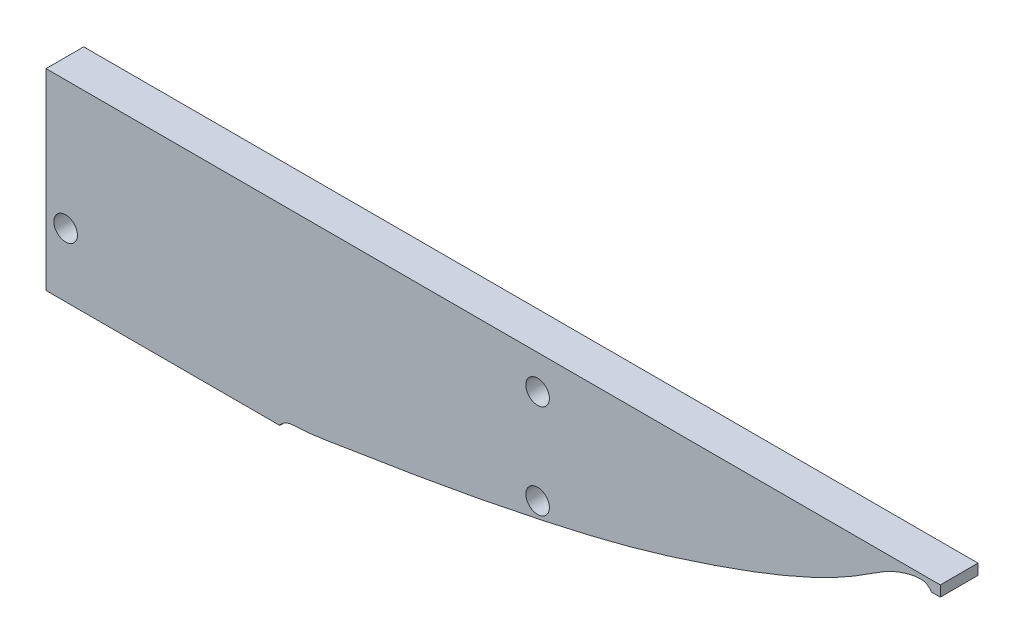
ISO-10303-21;
HEADER;
FILE_DESCRIPTION(('STEP AP214'),'2;1');
FILE_NAME('part.step','',(''),(''),'','','');
FILE_SCHEMA(('AUTOMOTIVE_DESIGN { 1 0 10303 214 1 1 1 1 }'));
ENDSEC;
DATA;
#1=APPLICATION_CONTEXT('core data for automotive mechanical design processes');
#2=APPLICATION_PROTOCOL_DEFINITION('international standard','automotive_design',2000,#1);
#3=PRODUCT_CONTEXT('',#1,'mechanical');
#4=PRODUCT('Part','Part','',(#3));
#5=PRODUCT_RELATED_PRODUCT_CATEGORY('part','',(#4));
#6=PRODUCT_DEFINITION_FORMATION('','',#4);
#7=PRODUCT_DEFINITION_CONTEXT('part definition',#1,'design');
#8=PRODUCT_DEFINITION('design','',#6,#7);
#9=PRODUCT_DEFINITION_SHAPE('','',#8);
#10=(LENGTH_UNIT() NAMED_UNIT(*) SI_UNIT(.MILLI.,.METRE.));
#11=(NAMED_UNIT(*) PLANE_ANGLE_UNIT() SI_UNIT($,.RADIAN.));
#12=(NAMED_UNIT(*) SI_UNIT($,.STERADIAN.) SOLID_ANGLE_UNIT());
#13=UNCERTAINTY_MEASURE_WITH_UNIT(LENGTH_MEASURE(1.E-05),#10,'distance_accuracy_value','');
#14=(GEOMETRIC_REPRESENTATION_CONTEXT(3) GLOBAL_UNCERTAINTY_ASSIGNED_CONTEXT((#13)) GLOBAL_UNIT_ASSIGNED_CONTEXT((#10,
#11,#12)) REPRESENTATION_CONTEXT('',''));
#15=CARTESIAN_POINT('',(0.,0.,0.));
#16=DIRECTION('',(0.,0.,1.));
#17=DIRECTION('',(1.,0.,0.));
#18=AXIS2_PLACEMENT_3D('',#15,#16,#17);
#19=CARTESIAN_POINT('',(16.5327715800535,-24.4684718343884,308.));
#20=DIRECTION('',(0.,0.,-1.));
#21=DIRECTION('',(-1.,0.,0.));
#22=AXIS2_PLACEMENT_3D('',#19,#20,#21);
#23=PLANE('',#22);
#24=CARTESIAN_POINT('',(0.0705666698621599,-25.,308.));
#25=DIRECTION('',(0.,0.,-1.));
#26=DIRECTION('',(-1.,0.,0.));
#27=AXIS2_PLACEMENT_3D('',#24,#25,#26);
#28=CIRCLE('',#27,2.5);
#29=CARTESIAN_POINT('',(-2.42943333013784,-25.,308.));
#30=VERTEX_POINT('',#29);
#31=EDGE_CURVE('E246',#30,#30,#28,.F.);
#32=ORIENTED_EDGE('',*,*,#31,.F.);
#33=EDGE_LOOP('',(#32));
#34=FACE_BOUND('',#33,.T.);
#35=CARTESIAN_POINT('',(83.5994431739806,0.,308.));
#36=CARTESIAN_POINT('',(83.569014411832,0.0928823345712149,308.));
#37=CARTESIAN_POINT('',(83.5110052269392,0.172261108299648,308.));
#38=CARTESIAN_POINT('',(83.3760459387699,0.311907780049764,308.));
#39=CARTESIAN_POINT('',(83.3022919426749,0.374486092446247,308.));
#40=CARTESIAN_POINT('',(83.0817548813278,0.563058106145713,308.));
#41=CARTESIAN_POINT('',(82.938606402496,0.693248681310297,308.));
#42=CARTESIAN_POINT('',(82.6268716090671,0.924256644247235,308.));
#43=CARTESIAN_POINT('',(82.4623978542379,1.023272232158,308.));
#44=CARTESIAN_POINT('',(82.1016141202814,1.15954203405239,308.));
#45=CARTESIAN_POINT('',(81.9099773876242,1.19977717663149,308.));
#46=CARTESIAN_POINT('',(81.5288046390951,1.24481375090888,308.));
#47=CARTESIAN_POINT('',(81.3359366722028,1.25109399115655,308.));
#48=CARTESIAN_POINT('',(80.9496815449031,1.24567023160893,308.));
#49=CARTESIAN_POINT('',(80.7580322473343,1.23478307545273,308.));
#50=CARTESIAN_POINT('',(80.1867358356821,1.18192776826324,308.));
#51=CARTESIAN_POINT('',(79.8109144596942,1.11880208226468,308.));
#52=CARTESIAN_POINT('',(79.0640908517205,0.965899328184112,308.));
#53=CARTESIAN_POINT('',(78.6931653849524,0.875697724303409,308.));
#54=CARTESIAN_POINT('',(77.9557369644508,0.670836628462019,308.));
#55=CARTESIAN_POINT('',(77.589112504302,0.556414448791862,308.));
#56=CARTESIAN_POINT('',(76.5077350097606,0.184710813679019,308.));
#57=CARTESIAN_POINT('',(75.8074438446993,-0.103386236731456,308.));
#58=CARTESIAN_POINT('',(73.7664261730245,-1.08460417480571,308.));
#59=CARTESIAN_POINT('',(72.4826351030643,-1.88894694991597,308.));
#60=CARTESIAN_POINT('',(70.5711059909208,-3.12311740474168,308.));
#61=CARTESIAN_POINT('',(69.9359040916411,-3.5383265786026,308.));
#62=CARTESIAN_POINT('',(68.6576436677939,-4.35384217855476,308.));
#63=CARTESIAN_POINT('',(68.0155077590781,-4.75592773253934,308.));
#64=CARTESIAN_POINT('',(66.0720305681863,-5.92997149689604,308.));
#65=CARTESIAN_POINT('',(64.7527934355934,-6.66815728349756,308.));
#66=CARTESIAN_POINT('',(62.0824395903838,-8.08436682689352,308.));
#67=CARTESIAN_POINT('',(60.7316772443977,-8.76305933201459,308.));
#68=CARTESIAN_POINT('',(58.0065992277551,-10.0759953307011,308.));
#69=CARTESIAN_POINT('',(56.6320573002908,-10.7098118403225,308.));
#70=CARTESIAN_POINT('',(53.8593195487676,-11.9328060521872,308.));
#71=CARTESIAN_POINT('',(52.4619833156743,-12.522156219572,308.));
#72=CARTESIAN_POINT('',(48.2501943680671,-14.2346740533643,308.));
#73=CARTESIAN_POINT('',(45.4141180418152,-15.3076903903626,308.));
#74=CARTESIAN_POINT('',(39.7124997352837,-17.3690101771438,308.));
#75=CARTESIAN_POINT('',(36.8450597623796,-18.3548456149246,308.));
#76=CARTESIAN_POINT('',(31.087506026426,-20.2519081080058,308.));
#77=CARTESIAN_POINT('',(28.1975476603768,-21.1641240834605,308.));
#78=CARTESIAN_POINT('',(22.3884258684236,-22.8937038366736,308.));
#79=CARTESIAN_POINT('',(19.4670292352081,-23.7076814815292,308.));
#80=CARTESIAN_POINT('',(13.5985139248987,-25.2292621872477,308.));
#81=CARTESIAN_POINT('',(10.6516305069243,-25.9371829190082,308.));
#82=CARTESIAN_POINT('',(4.74215554202897,-27.2872475389897,308.));
#83=CARTESIAN_POINT('',(1.78010703581329,-27.9328314143551,308.));
#84=CARTESIAN_POINT('',(-4.15195666526218,-29.1841441009789,308.));
#85=CARTESIAN_POINT('',(-7.12211245323295,-29.7891512183765,308.));
#86=CARTESIAN_POINT('',(-13.0714459503328,-30.9539912255792,308.));
#87=CARTESIAN_POINT('',(-16.0512855479946,-31.5114115024143,308.));
#88=CARTESIAN_POINT('',(-25.0038821616534,-33.1110176239508,308.));
#89=CARTESIAN_POINT('',(-30.9882285894404,-34.0862468023346,308.));
#90=CARTESIAN_POINT('',(-38.4697498187019,-35.2963451187948,308.));
#91=CARTESIAN_POINT('',(-39.9661176563653,-35.5380060622653,308.));
#92=CARTESIAN_POINT('',(-42.21183292745,-35.8931190828389,308.));
#93=CARTESIAN_POINT('',(-42.9606043908522,-36.0102238938946,308.));
#94=CARTESIAN_POINT('',(-44.4584211918201,-36.2426970751052,308.));
#95=CARTESIAN_POINT('',(-45.2071798132574,-36.3602389703947,308.));
#96=CARTESIAN_POINT('',(-46.7064930630044,-36.5809250841695,308.));
#97=CARTESIAN_POINT('',(-47.4573682202831,-36.6815670094364,308.));
#98=CARTESIAN_POINT('',(-48.5880952498826,-36.7973862738876,308.));
#99=CARTESIAN_POINT('',(-48.9657099581411,-36.8303744016312,308.));
#100=CARTESIAN_POINT('',(-49.722466301366,-36.88419429845,308.));
#101=CARTESIAN_POINT('',(-50.1018956687632,-36.9027353363387,308.));
#102=CARTESIAN_POINT('',(-50.8611777381364,-36.9364471082559,308.));
#103=CARTESIAN_POINT('',(-51.2406702224144,-36.9544856521897,308.));
#104=CARTESIAN_POINT('',(-51.9952630001848,-37.025530395185,308.));
#105=CARTESIAN_POINT('',(-52.3708496889112,-37.0746642440631,308.));
#106=CARTESIAN_POINT('',(-52.9251213305381,-37.2208798754533,308.));
#107=CARTESIAN_POINT('',(-53.1103949905341,-37.2832704718498,308.));
#108=CARTESIAN_POINT('',(-53.465883701788,-37.4465856711003,308.));
#109=CARTESIAN_POINT('',(-53.6302266404691,-37.5475617859195,308.));
#110=CARTESIAN_POINT('',(-53.9418010334809,-37.7741806960845,308.));
#111=CARTESIAN_POINT('',(-54.0879850708226,-37.9013333721469,308.));
#112=CARTESIAN_POINT('',(-54.3050133595815,-38.0953026052423,308.));
#113=CARTESIAN_POINT('',(-54.3764472272673,-38.1614420472346,308.));
#114=CARTESIAN_POINT('',(-54.5036780251636,-38.3082186299376,308.));
#115=CARTESIAN_POINT('',(-54.5576296452273,-38.3921202785415,308.));
#116=CARTESIAN_POINT('',(-54.5827361136511,-38.4856594735572,308.));
#117=B_SPLINE_CURVE_WITH_KNOTS('',3,(#35,#36,#37,#38,#39,#40,#41,#42,#43,#44,#45,#46,#47,#48,
#49,#50,#51,#52,#53,#54,#55,#56,#57,#58,#59,#60,#61,#62,#63,#64,#65,#66,#67,#68,#69,#70,#71,#72,
#73,#74,#75,#76,#77,#78,#79,#80,#81,#82,#83,#84,#85,#86,#87,#88,#89,#90,#91,#92,#93,#94,#95,#96,
#97,#98,#99,#100,#101,#102,#103,#104,#105,#106,#107,#108,#109,#110,#111,#112,#113,#114,#115,
#116),.UNSPECIFIED.,.F.,.F.,(4,2,2,2,2,2,2,2,2,2,2,2,2,2,2,2,2,2,2,2,2,2,2,2,2,2,2,2,2,2,2,2,2,
2,2,2,2,2,2,2,4),(0.,0.00195312499999989,0.00390624999999978,0.00781249999999978,
0.0117187499999997,0.0156249999999997,0.0195312499999997,0.0234374999999997,0.0312499999999996,
0.0390624999999996,0.0468749999999996,0.0624999999999997,0.09375,0.109375,0.125,0.15625,0.1875,
0.21875,0.25,0.3125,0.375,0.4375,0.5,0.5625,0.625,0.6875,0.75,0.875000000000001,
0.906250000000001,0.921875,0.9375,0.953125,0.9609375,0.96875,0.9765625,0.984375,0.98828125,
0.9921875,0.99609375,0.998046875,1.),.UNSPECIFIED.);
#118=CARTESIAN_POINT('',(-54.5827361136511,-38.4856594735572,308.));
#119=VERTEX_POINT('',#118);
#120=CARTESIAN_POINT('',(83.5994431739805,0.,308.));
#121=VERTEX_POINT('',#120);
#122=EDGE_CURVE('E196',#119,#121,#117,.F.);
#123=ORIENTED_EDGE('',*,*,#122,.T.);
#124=DIRECTION('',(1.,0.,0.));
#125=VECTOR('',#124,1.);
#126=CARTESIAN_POINT('',(83.5994431739805,0.,308.));
#127=LINE('',#126,#125);
#128=CARTESIAN_POINT('',(85.4457825657922,0.,308.));
#129=VERTEX_POINT('',#128);
#130=EDGE_CURVE('E90',#121,#129,#127,.T.);
#131=ORIENTED_EDGE('',*,*,#130,.T.);
#132=DIRECTION('',(0.,1.,0.));
#133=VECTOR('',#132,1.);
#134=CARTESIAN_POINT('',(85.4457825657922,2.25600000000004,308.));
#135=LINE('',#134,#133);
#136=CARTESIAN_POINT('',(85.4457825657922,2.25600000000004,308.));
#137=VERTEX_POINT('',#136);
#138=EDGE_CURVE('E103',#129,#137,#135,.T.);
#139=ORIENTED_EDGE('',*,*,#138,.T.);
#140=DIRECTION('',(-1.,0.,0.));
#141=VECTOR('',#140,1.);
#142=CARTESIAN_POINT('',(85.4457825657922,2.25600000000004,308.));
#143=LINE('',#142,#141);
#144=CARTESIAN_POINT('',(-104.161406960419,2.25600000000003,308.));
#145=VERTEX_POINT('',#144);
#146=EDGE_CURVE('E97',#137,#145,#143,.T.);
#147=ORIENTED_EDGE('',*,*,#146,.T.);
#148=DIRECTION('',(0.,-1.,0.));
#149=VECTOR('',#148,1.);
#150=CARTESIAN_POINT('',(-104.161406960417,-38.4902322257059,308.));
#151=LINE('',#150,#149);
#152=CARTESIAN_POINT('',(-104.161406960417,-38.4902322257059,308.));
#153=VERTEX_POINT('',#152);
#154=EDGE_CURVE('E101',#145,#153,#151,.T.);
#155=ORIENTED_EDGE('',*,*,#154,.T.);
#156=CARTESIAN_POINT('',(-54.5827361136511,-38.4856594735572,308.));
#157=CARTESIAN_POINT('',(-71.1089596424161,-38.4879383108221,308.));
#158=CARTESIAN_POINT('',(-87.635183293645,-38.4894375189595,308.));
#159=CARTESIAN_POINT('',(-104.161406960419,-38.4902322257096,308.));
#160=B_SPLINE_CURVE_WITH_KNOTS('',3,(#156,#157,#158,#159),.UNSPECIFIED.,.F.,.F.,(4,4),(0.,1.),.UNSPECIFIED.);
#161=EDGE_CURVE('E51',#153,#119,#160,.F.);
#162=ORIENTED_EDGE('',*,*,#161,.T.);
#163=EDGE_LOOP('',(#123,#131,#139,#147,#155,#162));
#164=FACE_BOUND('',#163,.T.);
#165=CARTESIAN_POINT('',(0.0705666698621599,-4.96037406111782,308.));
#166=DIRECTION('',(0.,0.,-1.));
#167=DIRECTION('',(-1.,0.,0.));
#168=AXIS2_PLACEMENT_3D('',#165,#166,#167);
#169=CIRCLE('',#168,2.5);
#170=CARTESIAN_POINT('',(-2.42943333013784,-4.96037406111782,308.));
#171=VERTEX_POINT('',#170);
#172=EDGE_CURVE('E238',#171,#171,#169,.F.);
#173=ORIENTED_EDGE('',*,*,#172,.F.);
#174=EDGE_LOOP('',(#173));
#175=FACE_BOUND('',#174,.T.);
#176=CARTESIAN_POINT('',(-100.,-25.,308.));
#177=DIRECTION('',(0.,0.,-1.));
#178=DIRECTION('',(-1.,0.,0.));
#179=AXIS2_PLACEMENT_3D('',#176,#177,#178);
#180=CIRCLE('',#179,2.5);
#181=CARTESIAN_POINT('',(-102.5,-25.,308.));
#182=VERTEX_POINT('',#181);
#183=EDGE_CURVE('E253',#182,#182,#180,.F.);
#184=ORIENTED_EDGE('',*,*,#183,.F.);
#185=EDGE_LOOP('',(#184));
#186=FACE_BOUND('',#185,.T.);
#187=ADVANCED_FACE('F30',(#34,#164,#175,#186),#23,.F.);
#188=CARTESIAN_POINT('',(16.5327715800535,-24.4684718343884,300.));
#189=DIRECTION('',(0.,0.,-1.));
#190=DIRECTION('',(-1.,0.,0.));
#191=AXIS2_PLACEMENT_3D('',#188,#189,#190);
#192=PLANE('',#191);
#193=CARTESIAN_POINT('',(0.0705666698621599,-25.,300.));
#194=DIRECTION('',(0.,0.,-1.));
#195=DIRECTION('',(-1.,0.,0.));
#196=AXIS2_PLACEMENT_3D('',#193,#194,#195);
#197=CIRCLE('',#196,2.5);
#198=CARTESIAN_POINT('',(-2.42943333013784,-25.,300.));
#199=VERTEX_POINT('',#198);
#200=EDGE_CURVE('E241',#199,#199,#197,.F.);
#201=ORIENTED_EDGE('',*,*,#200,.T.);
#202=EDGE_LOOP('',(#201));
#203=FACE_BOUND('',#202,.T.);
#204=CARTESIAN_POINT('',(-54.5827361136511,-38.4856594735572,300.));
#205=CARTESIAN_POINT('',(-54.5576296452273,-38.3921202785415,300.));
#206=CARTESIAN_POINT('',(-54.5036780251636,-38.3082186299376,300.));
#207=CARTESIAN_POINT('',(-54.3764472272673,-38.1614420472346,300.));
#208=CARTESIAN_POINT('',(-54.3050133595815,-38.0953026052423,300.));
#209=CARTESIAN_POINT('',(-54.0879850708226,-37.9013333721469,300.));
#210=CARTESIAN_POINT('',(-53.9418010334809,-37.7741806960845,300.));
#211=CARTESIAN_POINT('',(-53.6302266404691,-37.5475617859195,300.));
#212=CARTESIAN_POINT('',(-53.465883701788,-37.4465856711003,300.));
#213=CARTESIAN_POINT('',(-53.1103949905341,-37.2832704718498,300.));
#214=CARTESIAN_POINT('',(-52.9251213305381,-37.2208798754533,300.));
#215=CARTESIAN_POINT('',(-52.3708496889112,-37.0746642440631,300.));
#216=CARTESIAN_POINT('',(-51.9952630001848,-37.025530395185,300.));
#217=CARTESIAN_POINT('',(-51.2406702224144,-36.9544856521897,300.));
#218=CARTESIAN_POINT('',(-50.8611777381364,-36.9364471082559,300.));
#219=CARTESIAN_POINT('',(-50.1018956687632,-36.9027353363387,300.));
#220=CARTESIAN_POINT('',(-49.722466301366,-36.88419429845,300.));
#221=CARTESIAN_POINT('',(-48.9657099581411,-36.8303744016312,300.));
#222=CARTESIAN_POINT('',(-48.5880952498826,-36.7973862738876,300.));
#223=CARTESIAN_POINT('',(-47.4573682202831,-36.6815670094364,300.));
#224=CARTESIAN_POINT('',(-46.7064930630044,-36.5809250841695,300.));
#225=CARTESIAN_POINT('',(-45.2071798132574,-36.3602389703947,300.));
#226=CARTESIAN_POINT('',(-44.4584211918201,-36.2426970751052,300.));
#227=CARTESIAN_POINT('',(-42.9606043908522,-36.0102238938946,300.));
#228=CARTESIAN_POINT('',(-42.21183292745,-35.8931190828389,300.));
#229=CARTESIAN_POINT('',(-39.9661176563653,-35.5380060622653,300.));
#230=CARTESIAN_POINT('',(-38.4697498187019,-35.2963451187948,300.));
#231=CARTESIAN_POINT('',(-30.9882285894404,-34.0862468023346,300.));
#232=CARTESIAN_POINT('',(-25.0038821616534,-33.1110176239508,300.));
#233=CARTESIAN_POINT('',(-16.0512855479946,-31.5114115024143,300.));
#234=CARTESIAN_POINT('',(-13.0714459503328,-30.9539912255792,300.));
#235=CARTESIAN_POINT('',(-7.12211245323295,-29.7891512183765,300.));
#236=CARTESIAN_POINT('',(-4.15195666526218,-29.1841441009789,300.));
#237=CARTESIAN_POINT('',(1.78010703581329,-27.9328314143551,300.));
#238=CARTESIAN_POINT('',(4.74215554202897,-27.2872475389897,300.));
#239=CARTESIAN_POINT('',(10.6516305069243,-25.9371829190082,300.));
#240=CARTESIAN_POINT('',(13.5985139248987,-25.2292621872477,300.));
#241=CARTESIAN_POINT('',(19.4670292352081,-23.7076814815292,300.));
#242=CARTESIAN_POINT('',(22.3884258684236,-22.8937038366736,300.));
#243=CARTESIAN_POINT('',(28.1975476603768,-21.1641240834605,300.));
#244=CARTESIAN_POINT('',(31.087506026426,-20.2519081080058,300.));
#245=CARTESIAN_POINT('',(36.8450597623796,-18.3548456149246,300.));
#246=CARTESIAN_POINT('',(39.7124997352837,-17.3690101771438,300.));
#247=CARTESIAN_POINT('',(45.4141180418152,-15.3076903903626,300.));
#248=CARTESIAN_POINT('',(48.2501943680671,-14.2346740533643,300.));
#249=CARTESIAN_POINT('',(52.4619833156743,-12.522156219572,300.));
#250=CARTESIAN_POINT('',(53.8593195487676,-11.9328060521872,300.));
#251=CARTESIAN_POINT('',(56.6320573002908,-10.7098118403225,300.));
#252=CARTESIAN_POINT('',(58.0065992277551,-10.0759953307011,300.));
#253=CARTESIAN_POINT('',(60.7316772443977,-8.76305933201459,300.));
#254=CARTESIAN_POINT('',(62.0824395903838,-8.08436682689352,300.));
#255=CARTESIAN_POINT('',(64.7527934355934,-6.66815728349756,300.));
#256=CARTESIAN_POINT('',(66.0720305681863,-5.92997149689604,300.));
#257=CARTESIAN_POINT('',(68.0155077590781,-4.75592773253934,300.));
#258=CARTESIAN_POINT('',(68.6576436677939,-4.35384217855476,300.));
#259=CARTESIAN_POINT('',(69.9359040916411,-3.5383265786026,300.));
#260=CARTESIAN_POINT('',(70.5711059909208,-3.12311740474168,300.));
#261=CARTESIAN_POINT('',(72.4826351030643,-1.88894694991597,300.));
#262=CARTESIAN_POINT('',(73.7664261730245,-1.08460417480571,300.));
#263=CARTESIAN_POINT('',(75.8074438446993,-0.103386236731456,300.));
#264=CARTESIAN_POINT('',(76.5077350097606,0.184710813679019,300.));
#265=CARTESIAN_POINT('',(77.589112504302,0.556414448791862,300.));
#266=CARTESIAN_POINT('',(77.9557369644508,0.670836628462019,300.));
#267=CARTESIAN_POINT('',(78.6931653849524,0.875697724303409,300.));
#268=CARTESIAN_POINT('',(79.0640908517205,0.965899328184112,300.));
#269=CARTESIAN_POINT('',(79.8109144596942,1.11880208226468,300.));
#270=CARTESIAN_POINT('',(80.1867358356821,1.18192776826324,300.));
#271=CARTESIAN_POINT('',(80.7580322473343,1.23478307545273,300.));
#272=CARTESIAN_POINT('',(80.9496815449031,1.24567023160893,300.));
#273=CARTESIAN_POINT('',(81.3359366722028,1.25109399115655,300.));
#274=CARTESIAN_POINT('',(81.5288046390951,1.24481375090888,300.));
#275=CARTESIAN_POINT('',(81.9099773876242,1.19977717663149,300.));
#276=CARTESIAN_POINT('',(82.1016141202814,1.15954203405239,300.));
#277=CARTESIAN_POINT('',(82.4623978542379,1.023272232158,300.));
#278=CARTESIAN_POINT('',(82.6268716090671,0.924256644247235,300.));
#279=CARTESIAN_POINT('',(82.938606402496,0.693248681310297,300.));
#280=CARTESIAN_POINT('',(83.0817548813278,0.563058106145713,300.));
#281=CARTESIAN_POINT('',(83.3022919426749,0.374486092446247,300.));
#282=CARTESIAN_POINT('',(83.3760459387699,0.311907780049764,300.));
#283=CARTESIAN_POINT('',(83.5110052269392,0.172261108299648,300.));
#284=CARTESIAN_POINT('',(83.569014411832,0.0928823345712149,300.));
#285=CARTESIAN_POINT('',(83.5994431739806,0.,300.));
#286=B_SPLINE_CURVE_WITH_KNOTS('',3,(#204,#205,#206,#207,#208,#209,#210,#211,#212,#213,#214,
#215,#216,#217,#218,#219,#220,#221,#222,#223,#224,#225,#226,#227,#228,#229,#230,#231,#232,#233,
#234,#235,#236,#237,#238,#239,#240,#241,#242,#243,#244,#245,#246,#247,#248,#249,#250,#251,#252,
#253,#254,#255,#256,#257,#258,#259,#260,#261,#262,#263,#264,#265,#266,#267,#268,#269,#270,#271,
#272,#273,#274,#275,#276,#277,#278,#279,#280,#281,#282,#283,#284,#285),.UNSPECIFIED.,.F.,.F.,(4,
2,2,2,2,2,2,2,2,2,2,2,2,2,2,2,2,2,2,2,2,2,2,2,2,2,2,2,2,2,2,2,2,2,2,2,2,2,2,2,4),(0.,
0.00195312499999989,0.00390624999999978,0.00781249999999978,0.0117187499999998,
0.0156249999999998,0.0234374999999997,0.0312499999999997,0.0390624999999997,0.0468749999999997,
0.0624999999999996,0.0781249999999996,0.0937499999999994,0.124999999999999,0.25,0.3125,0.375,
0.4375,0.5,0.5625,0.625,0.6875,0.75,0.78125,0.8125,0.84375,0.875,0.890625,0.90625,0.9375,
0.953125,0.9609375,0.96875,0.9765625,0.98046875,0.984375,0.98828125,0.9921875,0.99609375,
0.998046875,1.),.UNSPECIFIED.);
#287=CARTESIAN_POINT('',(-54.5827361136511,-38.4856594735572,300.));
#288=VERTEX_POINT('',#287);
#289=CARTESIAN_POINT('',(83.5994431739805,0.,300.));
#290=VERTEX_POINT('',#289);
#291=EDGE_CURVE('E213',#288,#290,#286,.T.);
#292=ORIENTED_EDGE('',*,*,#291,.F.);
#293=CARTESIAN_POINT('',(-104.161406960419,-38.4902322257096,300.));
#294=CARTESIAN_POINT('',(-87.635183293645,-38.4894375189595,300.));
#295=CARTESIAN_POINT('',(-71.1089596424161,-38.4879383108221,300.));
#296=CARTESIAN_POINT('',(-54.5827361136511,-38.4856594735572,300.));
#297=B_SPLINE_CURVE_WITH_KNOTS('',3,(#293,#294,#295,#296),.UNSPECIFIED.,.F.,.F.,(4,4),(0.,1.),.UNSPECIFIED.);
#298=CARTESIAN_POINT('',(-104.161406960417,-38.4902322257059,300.));
#299=VERTEX_POINT('',#298);
#300=EDGE_CURVE('E81',#299,#288,#297,.T.);
#301=ORIENTED_EDGE('',*,*,#300,.F.);
#302=DIRECTION('',(0.,-1.,0.));
#303=VECTOR('',#302,1.);
#304=CARTESIAN_POINT('',(-104.161406960417,-38.4902322257059,300.));
#305=LINE('',#304,#303);
#306=CARTESIAN_POINT('',(-104.161406960419,2.25600000000003,300.));
#307=VERTEX_POINT('',#306);
#308=EDGE_CURVE('E75',#307,#299,#305,.T.);
#309=ORIENTED_EDGE('',*,*,#308,.F.);
#310=DIRECTION('',(-1.,0.,0.));
#311=VECTOR('',#310,1.);
#312=CARTESIAN_POINT('',(85.4457825657922,2.25600000000004,300.));
#313=LINE('',#312,#311);
#314=CARTESIAN_POINT('',(85.4457825657922,2.25600000000004,300.));
#315=VERTEX_POINT('',#314);
#316=EDGE_CURVE('E111',#315,#307,#313,.T.);
#317=ORIENTED_EDGE('',*,*,#316,.F.);
#318=DIRECTION('',(0.,1.,0.));
#319=VECTOR('',#318,1.);
#320=CARTESIAN_POINT('',(85.4457825657922,2.25600000000004,300.));
#321=LINE('',#320,#319);
#322=CARTESIAN_POINT('',(85.4457825657922,0.,300.));
#323=VERTEX_POINT('',#322);
#324=EDGE_CURVE('E158',#323,#315,#321,.T.);
#325=ORIENTED_EDGE('',*,*,#324,.F.);
#326=DIRECTION('',(1.,0.,0.));
#327=VECTOR('',#326,1.);
#328=CARTESIAN_POINT('',(83.5994431739805,0.,300.));
#329=LINE('',#328,#327);
#330=EDGE_CURVE('E163',#290,#323,#329,.T.);
#331=ORIENTED_EDGE('',*,*,#330,.F.);
#332=EDGE_LOOP('',(#292,#301,#309,#317,#325,#331));
#333=FACE_BOUND('',#332,.T.);
#334=CARTESIAN_POINT('',(0.0705666698621599,-4.96037406111782,300.));
#335=DIRECTION('',(0.,0.,-1.));
#336=DIRECTION('',(-1.,0.,0.));
#337=AXIS2_PLACEMENT_3D('',#334,#335,#336);
#338=CIRCLE('',#337,2.5);
#339=CARTESIAN_POINT('',(-2.42943333013784,-4.96037406111782,300.));
#340=VERTEX_POINT('',#339);
#341=EDGE_CURVE('E235',#340,#340,#338,.F.);
#342=ORIENTED_EDGE('',*,*,#341,.T.);
#343=EDGE_LOOP('',(#342));
#344=FACE_BOUND('',#343,.T.);
#345=CARTESIAN_POINT('',(-100.,-25.,300.));
#346=DIRECTION('',(0.,0.,-1.));
#347=DIRECTION('',(-1.,0.,0.));
#348=AXIS2_PLACEMENT_3D('',#345,#346,#347);
#349=CIRCLE('',#348,2.5);
#350=CARTESIAN_POINT('',(-102.5,-25.,300.));
#351=VERTEX_POINT('',#350);
#352=EDGE_CURVE('E249',#351,#351,#349,.F.);
#353=ORIENTED_EDGE('',*,*,#352,.T.);
#354=EDGE_LOOP('',(#353));
#355=FACE_BOUND('',#354,.T.);
#356=ADVANCED_FACE('F148',(#203,#333,#344,#355),#192,.T.);
#357=CARTESIAN_POINT('',(-54.5827361136511,-38.4856594735572,308.));
#358=CARTESIAN_POINT('',(-54.5576296452273,-38.3921202785415,308.));
#359=CARTESIAN_POINT('',(-54.5036780251636,-38.3082186299376,308.));
#360=CARTESIAN_POINT('',(-54.3764472272673,-38.1614420472346,308.));
#361=CARTESIAN_POINT('',(-54.3050133595815,-38.0953026052423,308.));
#362=CARTESIAN_POINT('',(-54.0879850708226,-37.9013333721469,308.));
#363=CARTESIAN_POINT('',(-53.9418010334809,-37.7741806960845,308.));
#364=CARTESIAN_POINT('',(-53.6302266404691,-37.5475617859195,308.));
#365=CARTESIAN_POINT('',(-53.465883701788,-37.4465856711003,308.));
#366=CARTESIAN_POINT('',(-53.1103949905341,-37.2832704718498,308.));
#367=CARTESIAN_POINT('',(-52.9251213305381,-37.2208798754533,308.));
#368=CARTESIAN_POINT('',(-52.3708496889112,-37.0746642440631,308.));
#369=CARTESIAN_POINT('',(-51.9952630001848,-37.025530395185,308.));
#370=CARTESIAN_POINT('',(-51.2406702224144,-36.9544856521897,308.));
#371=CARTESIAN_POINT('',(-50.8611777381364,-36.9364471082559,308.));
#372=CARTESIAN_POINT('',(-50.1018956687632,-36.9027353363387,308.));
#373=CARTESIAN_POINT('',(-49.722466301366,-36.88419429845,308.));
#374=CARTESIAN_POINT('',(-48.9657099581411,-36.8303744016312,308.));
#375=CARTESIAN_POINT('',(-48.5880952498826,-36.7973862738876,308.));
#376=CARTESIAN_POINT('',(-47.4573682202831,-36.6815670094364,308.));
#377=CARTESIAN_POINT('',(-46.7064930630044,-36.5809250841695,308.));
#378=CARTESIAN_POINT('',(-45.2071798132574,-36.3602389703947,308.));
#379=CARTESIAN_POINT('',(-44.4584211918201,-36.2426970751052,308.));
#380=CARTESIAN_POINT('',(-42.9606043908522,-36.0102238938946,308.));
#381=CARTESIAN_POINT('',(-42.21183292745,-35.8931190828389,308.));
#382=CARTESIAN_POINT('',(-39.9661176563653,-35.5380060622653,308.));
#383=CARTESIAN_POINT('',(-38.4697498187019,-35.2963451187948,308.));
#384=CARTESIAN_POINT('',(-30.9882285894404,-34.0862468023346,308.));
#385=CARTESIAN_POINT('',(-25.0038821616534,-33.1110176239508,308.));
#386=CARTESIAN_POINT('',(-16.0512855479946,-31.5114115024143,308.));
#387=CARTESIAN_POINT('',(-13.0714459503328,-30.9539912255792,308.));
#388=CARTESIAN_POINT('',(-7.12211245323295,-29.7891512183765,308.));
#389=CARTESIAN_POINT('',(-4.15195666526218,-29.1841441009789,308.));
#390=CARTESIAN_POINT('',(1.78010703581329,-27.9328314143551,308.));
#391=CARTESIAN_POINT('',(4.74215554202897,-27.2872475389897,308.));
#392=CARTESIAN_POINT('',(10.6516305069243,-25.9371829190082,308.));
#393=CARTESIAN_POINT('',(13.5985139248987,-25.2292621872477,308.));
#394=CARTESIAN_POINT('',(19.4670292352081,-23.7076814815292,308.));
#395=CARTESIAN_POINT('',(22.3884258684236,-22.8937038366736,308.));
#396=CARTESIAN_POINT('',(28.1975476603768,-21.1641240834605,308.));
#397=CARTESIAN_POINT('',(31.087506026426,-20.2519081080058,308.));
#398=CARTESIAN_POINT('',(36.8450597623796,-18.3548456149246,308.));
#399=CARTESIAN_POINT('',(39.7124997352837,-17.3690101771438,308.));
#400=CARTESIAN_POINT('',(45.4141180418152,-15.3076903903626,308.));
#401=CARTESIAN_POINT('',(48.2501943680671,-14.2346740533643,308.));
#402=CARTESIAN_POINT('',(52.4619833156743,-12.522156219572,308.));
#403=CARTESIAN_POINT('',(53.8593195487676,-11.9328060521872,308.));
#404=CARTESIAN_POINT('',(56.6320573002908,-10.7098118403225,308.));
#405=CARTESIAN_POINT('',(58.0065992277551,-10.0759953307011,308.));
#406=CARTESIAN_POINT('',(60.7316772443977,-8.76305933201459,308.));
#407=CARTESIAN_POINT('',(62.0824395903838,-8.08436682689352,308.));
#408=CARTESIAN_POINT('',(64.7527934355934,-6.66815728349756,308.));
#409=CARTESIAN_POINT('',(66.0720305681863,-5.92997149689604,308.));
#410=CARTESIAN_POINT('',(68.0155077590781,-4.75592773253934,308.));
#411=CARTESIAN_POINT('',(68.6576436677939,-4.35384217855476,308.));
#412=CARTESIAN_POINT('',(69.9359040916411,-3.5383265786026,308.));
#413=CARTESIAN_POINT('',(70.5711059909208,-3.12311740474168,308.));
#414=CARTESIAN_POINT('',(72.4826351030643,-1.88894694991597,308.));
#415=CARTESIAN_POINT('',(73.7664261730245,-1.08460417480571,308.));
#416=CARTESIAN_POINT('',(75.8074438446993,-0.103386236731456,308.));
#417=CARTESIAN_POINT('',(76.5077350097606,0.184710813679019,308.));
#418=CARTESIAN_POINT('',(77.589112504302,0.556414448791862,308.));
#419=CARTESIAN_POINT('',(77.9557369644508,0.670836628462019,308.));
#420=CARTESIAN_POINT('',(78.6931653849524,0.875697724303409,308.));
#421=CARTESIAN_POINT('',(79.0640908517205,0.965899328184112,308.));
#422=CARTESIAN_POINT('',(79.8109144596942,1.11880208226468,308.));
#423=CARTESIAN_POINT('',(80.1867358356821,1.18192776826324,308.));
#424=CARTESIAN_POINT('',(80.7580322473343,1.23478307545273,308.));
#425=CARTESIAN_POINT('',(80.9496815449031,1.24567023160893,308.));
#426=CARTESIAN_POINT('',(81.3359366722028,1.25109399115655,308.));
#427=CARTESIAN_POINT('',(81.5288046390951,1.24481375090888,308.));
#428=CARTESIAN_POINT('',(81.9099773876242,1.19977717663149,308.));
#429=CARTESIAN_POINT('',(82.1016141202814,1.15954203405239,308.));
#430=CARTESIAN_POINT('',(82.4623978542379,1.023272232158,308.));
#431=CARTESIAN_POINT('',(82.6268716090671,0.924256644247235,308.));
#432=CARTESIAN_POINT('',(82.938606402496,0.693248681310297,308.));
#433=CARTESIAN_POINT('',(83.0817548813278,0.563058106145713,308.));
#434=CARTESIAN_POINT('',(83.3022919426749,0.374486092446247,308.));
#435=CARTESIAN_POINT('',(83.3760459387699,0.311907780049764,308.));
#436=CARTESIAN_POINT('',(83.5110052269392,0.172261108299648,308.));
#437=CARTESIAN_POINT('',(83.569014411832,0.0928823345712149,308.));
#438=CARTESIAN_POINT('',(83.5994431739806,0.,308.));
#439=B_SPLINE_CURVE_WITH_KNOTS('',3,(#357,#358,#359,#360,#361,#362,#363,#364,#365,#366,#367,
#368,#369,#370,#371,#372,#373,#374,#375,#376,#377,#378,#379,#380,#381,#382,#383,#384,#385,#386,
#387,#388,#389,#390,#391,#392,#393,#394,#395,#396,#397,#398,#399,#400,#401,#402,#403,#404,#405,
#406,#407,#408,#409,#410,#411,#412,#413,#414,#415,#416,#417,#418,#419,#420,#421,#422,#423,#424,
#425,#426,#427,#428,#429,#430,#431,#432,#433,#434,#435,#436,#437,#438),.UNSPECIFIED.,.F.,.F.,(4,
2,2,2,2,2,2,2,2,2,2,2,2,2,2,2,2,2,2,2,2,2,2,2,2,2,2,2,2,2,2,2,2,2,2,2,2,2,2,2,4),(0.,
0.00195312499999989,0.00390624999999978,0.00781249999999978,0.0117187499999998,
0.0156249999999998,0.0234374999999997,0.0312499999999997,0.0390624999999997,0.0468749999999997,
0.0624999999999996,0.0781249999999996,0.0937499999999994,0.124999999999999,0.25,0.3125,0.375,
0.4375,0.5,0.5625,0.625,0.6875,0.75,0.78125,0.8125,0.84375,0.875,0.890625,0.90625,0.9375,
0.953125,0.9609375,0.96875,0.9765625,0.98046875,0.984375,0.98828125,0.9921875,0.99609375,
0.998046875,1.),.UNSPECIFIED.);
#440=DIRECTION('',(0.,0.,-1.));
#441=VECTOR('',#440,1.);
#442=SURFACE_OF_LINEAR_EXTRUSION('',#439,#441);
#443=ORIENTED_EDGE('',*,*,#291,.T.);
#444=DIRECTION('',(0.,0.,-1.));
#445=VECTOR('',#444,1.);
#446=CARTESIAN_POINT('',(83.5994431739805,0.,308.));
#447=LINE('',#446,#445);
#448=EDGE_CURVE('E11',#121,#290,#447,.T.);
#449=ORIENTED_EDGE('',*,*,#448,.F.);
#450=ORIENTED_EDGE('',*,*,#122,.F.);
#451=DIRECTION('',(0.,0.,-1.));
#452=VECTOR('',#451,1.);
#453=CARTESIAN_POINT('',(-54.5827361136511,-38.4856594735572,308.));
#454=LINE('',#453,#452);
#455=EDGE_CURVE('E117',#119,#288,#454,.T.);
#456=ORIENTED_EDGE('',*,*,#455,.T.);
#457=EDGE_LOOP('',(#443,#449,#450,#456));
#458=FACE_BOUND('',#457,.T.);
#459=ADVANCED_FACE('F32',(#458),#442,.F.);
#460=CARTESIAN_POINT('',(83.5994431739805,0.,308.));
#461=DIRECTION('',(0.,1.,0.));
#462=DIRECTION('',(-1.,0.,0.));
#463=AXIS2_PLACEMENT_3D('',#460,#461,#462);
#464=PLANE('',#463);
#465=ORIENTED_EDGE('',*,*,#330,.T.);
#466=DIRECTION('',(0.,0.,-1.));
#467=VECTOR('',#466,1.);
#468=CARTESIAN_POINT('',(85.4457825657922,0.,308.));
#469=LINE('',#468,#467);
#470=EDGE_CURVE('E42',#129,#323,#469,.T.);
#471=ORIENTED_EDGE('',*,*,#470,.F.);
#472=ORIENTED_EDGE('',*,*,#130,.F.);
#473=ORIENTED_EDGE('',*,*,#448,.T.);
#474=EDGE_LOOP('',(#465,#471,#472,#473));
#475=FACE_BOUND('',#474,.T.);
#476=ADVANCED_FACE('F274',(#475),#464,.F.);
#477=CARTESIAN_POINT('',(85.4457825657922,2.25600000000004,308.));
#478=DIRECTION('',(-1.,0.,0.));
#479=DIRECTION('',(0.,0.,1.));
#480=AXIS2_PLACEMENT_3D('',#477,#478,#479);
#481=PLANE('',#480);
#482=ORIENTED_EDGE('',*,*,#324,.T.);
#483=DIRECTION('',(0.,0.,-1.));
#484=VECTOR('',#483,1.);
#485=CARTESIAN_POINT('',(85.4457825657922,2.25600000000004,308.));
#486=LINE('',#485,#484);
#487=EDGE_CURVE('E112',#137,#315,#486,.T.);
#488=ORIENTED_EDGE('',*,*,#487,.F.);
#489=ORIENTED_EDGE('',*,*,#138,.F.);
#490=ORIENTED_EDGE('',*,*,#470,.T.);
#491=EDGE_LOOP('',(#482,#488,#489,#490));
#492=FACE_BOUND('',#491,.T.);
#493=ADVANCED_FACE('F322',(#492),#481,.F.);
#494=CARTESIAN_POINT('',(85.4457825657922,2.25600000000004,308.));
#495=DIRECTION('',(0.,-1.,0.));
#496=DIRECTION('',(1.,0.,0.));
#497=AXIS2_PLACEMENT_3D('',#494,#495,#496);
#498=PLANE('',#497);
#499=ORIENTED_EDGE('',*,*,#316,.T.);
#500=DIRECTION('',(0.,0.,-1.));
#501=VECTOR('',#500,1.);
#502=CARTESIAN_POINT('',(-104.161406960419,2.25600000000003,308.));
#503=LINE('',#502,#501);
#504=EDGE_CURVE('E108',#145,#307,#503,.T.);
#505=ORIENTED_EDGE('',*,*,#504,.F.);
#506=ORIENTED_EDGE('',*,*,#146,.F.);
#507=ORIENTED_EDGE('',*,*,#487,.T.);
#508=EDGE_LOOP('',(#499,#505,#506,#507));
#509=FACE_BOUND('',#508,.T.);
#510=ADVANCED_FACE('F109',(#509),#498,.F.);
#511=CARTESIAN_POINT('',(-104.161406960417,-38.4902322257059,308.));
#512=DIRECTION('',(1.,0.,0.));
#513=DIRECTION('',(0.,1.,0.));
#514=AXIS2_PLACEMENT_3D('',#511,#512,#513);
#515=PLANE('',#514);
#516=ORIENTED_EDGE('',*,*,#308,.T.);
#517=DIRECTION('',(0.,0.,-1.));
#518=VECTOR('',#517,1.);
#519=CARTESIAN_POINT('',(-104.161406960417,-38.4902322257059,308.));
#520=LINE('',#519,#518);
#521=EDGE_CURVE('E113',#153,#299,#520,.T.);
#522=ORIENTED_EDGE('',*,*,#521,.F.);
#523=ORIENTED_EDGE('',*,*,#154,.F.);
#524=ORIENTED_EDGE('',*,*,#504,.T.);
#525=EDGE_LOOP('',(#516,#522,#523,#524));
#526=FACE_BOUND('',#525,.T.);
#527=ADVANCED_FACE('F115',(#526),#515,.F.);
#528=CARTESIAN_POINT('',(-104.161406960419,-38.4902322257096,308.));
#529=CARTESIAN_POINT('',(-87.635183293645,-38.4894375189595,308.));
#530=CARTESIAN_POINT('',(-71.1089596424161,-38.4879383108221,308.));
#531=CARTESIAN_POINT('',(-54.5827361136511,-38.4856594735572,308.));
#532=B_SPLINE_CURVE_WITH_KNOTS('',3,(#528,#529,#530,#531),.UNSPECIFIED.,.F.,.F.,(4,4),(0.,1.),.UNSPECIFIED.);
#533=DIRECTION('',(0.,0.,-1.));
#534=VECTOR('',#533,1.);
#535=SURFACE_OF_LINEAR_EXTRUSION('',#532,#534);
#536=ORIENTED_EDGE('',*,*,#300,.T.);
#537=ORIENTED_EDGE('',*,*,#455,.F.);
#538=ORIENTED_EDGE('',*,*,#161,.F.);
#539=ORIENTED_EDGE('',*,*,#521,.T.);
#540=EDGE_LOOP('',(#536,#537,#538,#539));
#541=FACE_BOUND('',#540,.T.);
#542=ADVANCED_FACE('F136',(#541),#535,.F.);
#543=CARTESIAN_POINT('',(0.0705666698621599,-4.96037406111782,308.));
#544=DIRECTION('',(0.,0.,-1.));
#545=DIRECTION('',(-1.,0.,0.));
#546=AXIS2_PLACEMENT_3D('',#543,#544,#545);
#547=CYLINDRICAL_SURFACE('',#546,2.5);
#548=ORIENTED_EDGE('',*,*,#341,.F.);
#549=EDGE_LOOP('',(#548));
#550=FACE_BOUND('',#549,.T.);
#551=ORIENTED_EDGE('',*,*,#172,.T.);
#552=EDGE_LOOP('',(#551));
#553=FACE_BOUND('',#552,.T.);
#554=ADVANCED_FACE('F147',(#550,#553),#547,.F.);
#555=CARTESIAN_POINT('',(0.0705666698621599,-25.,308.));
#556=DIRECTION('',(0.,0.,-1.));
#557=DIRECTION('',(-1.,0.,0.));
#558=AXIS2_PLACEMENT_3D('',#555,#556,#557);
#559=CYLINDRICAL_SURFACE('',#558,2.5);
#560=ORIENTED_EDGE('',*,*,#200,.F.);
#561=EDGE_LOOP('',(#560));
#562=FACE_BOUND('',#561,.T.);
#563=ORIENTED_EDGE('',*,*,#31,.T.);
#564=EDGE_LOOP('',(#563));
#565=FACE_BOUND('',#564,.T.);
#566=ADVANCED_FACE('F260',(#562,#565),#559,.F.);
#567=CARTESIAN_POINT('',(-100.,-25.,308.));
#568=DIRECTION('',(0.,0.,-1.));
#569=DIRECTION('',(-1.,0.,0.));
#570=AXIS2_PLACEMENT_3D('',#567,#568,#569);
#571=CYLINDRICAL_SURFACE('',#570,2.5);
#572=ORIENTED_EDGE('',*,*,#352,.F.);
#573=EDGE_LOOP('',(#572));
#574=FACE_BOUND('',#573,.T.);
#575=ORIENTED_EDGE('',*,*,#183,.T.);
#576=EDGE_LOOP('',(#575));
#577=FACE_BOUND('',#576,.T.);
#578=ADVANCED_FACE('F257',(#574,#577),#571,.F.);
#579=CLOSED_SHELL('',(#187,#356,#459,#476,#493,#510,#527,#542,#554,#566,#578));
#580=MANIFOLD_SOLID_BREP('B2',#579);
#581=ADVANCED_BREP_SHAPE_REPRESENTATION('',(#18,#580),#14);
#582=SHAPE_DEFINITION_REPRESENTATION(#9,#581);
ENDSEC;
END-ISO-10303-21;
